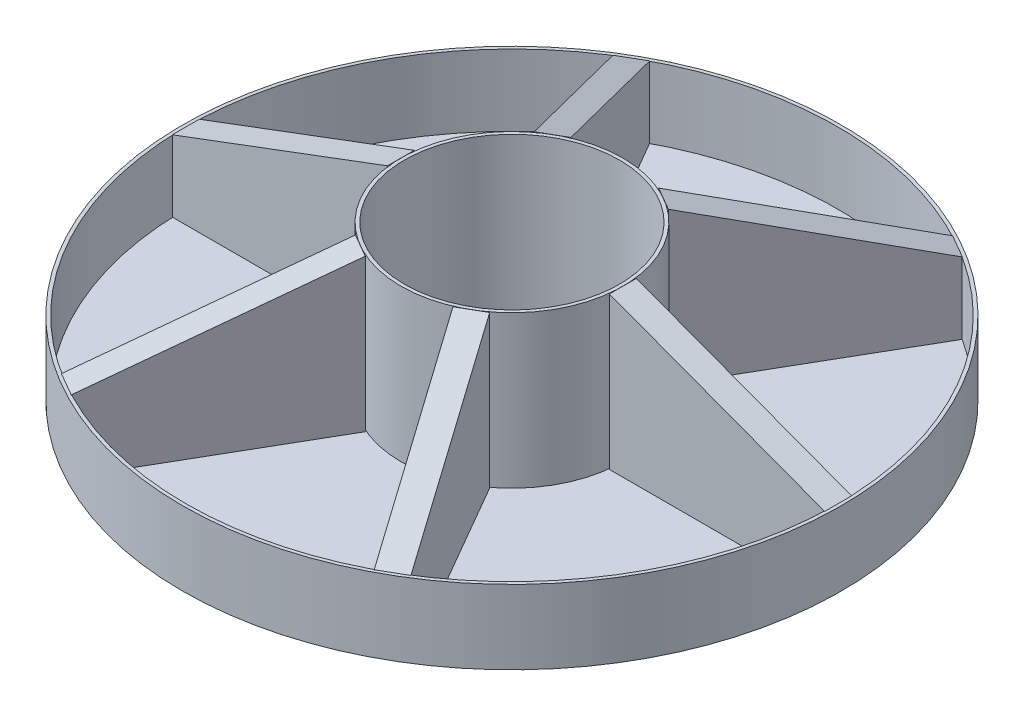
ISO-10303-21;
HEADER;
FILE_DESCRIPTION(('STEP AP214'),'2;1');
FILE_NAME('part.step','',(''),(''),'','','');
FILE_SCHEMA(('AUTOMOTIVE_DESIGN { 1 0 10303 214 1 1 1 1 }'));
ENDSEC;
DATA;
#1=APPLICATION_CONTEXT('core data for automotive mechanical design processes');
#2=APPLICATION_PROTOCOL_DEFINITION('international standard','automotive_design',2000,#1);
#3=PRODUCT_CONTEXT('',#1,'mechanical');
#4=PRODUCT('Part','Part','',(#3));
#5=PRODUCT_RELATED_PRODUCT_CATEGORY('part','',(#4));
#6=PRODUCT_DEFINITION_FORMATION('','',#4);
#7=PRODUCT_DEFINITION_CONTEXT('part definition',#1,'design');
#8=PRODUCT_DEFINITION('design','',#6,#7);
#9=PRODUCT_DEFINITION_SHAPE('','',#8);
#10=(LENGTH_UNIT() NAMED_UNIT(*) SI_UNIT(.MILLI.,.METRE.));
#11=(NAMED_UNIT(*) PLANE_ANGLE_UNIT() SI_UNIT($,.RADIAN.));
#12=(NAMED_UNIT(*) SI_UNIT($,.STERADIAN.) SOLID_ANGLE_UNIT());
#13=UNCERTAINTY_MEASURE_WITH_UNIT(LENGTH_MEASURE(1.E-05),#10,'distance_accuracy_value','');
#14=(GEOMETRIC_REPRESENTATION_CONTEXT(3) GLOBAL_UNCERTAINTY_ASSIGNED_CONTEXT((#13)) GLOBAL_UNIT_ASSIGNED_CONTEXT((#10,
#11,#12)) REPRESENTATION_CONTEXT('',''));
#15=CARTESIAN_POINT('',(0.,0.,0.));
#16=DIRECTION('',(0.,0.,1.));
#17=DIRECTION('',(1.,0.,0.));
#18=AXIS2_PLACEMENT_3D('',#15,#16,#17);
#19=CARTESIAN_POINT('',(-0.433012701892216,0.1,0.250000000000005));
#20=DIRECTION('',(0.,-1.,0.));
#21=DIRECTION('',(0.50000000000001,0.,0.866025403784433));
#22=AXIS2_PLACEMENT_3D('',#19,#20,#21);
#23=PLANE('',#22);
#24=DIRECTION('',(-0.50000000000001,0.,-0.866025403784433));
#25=VECTOR('',#24,1.);
#26=CARTESIAN_POINT('',(0.433012701892216,0.1,-0.250000000000005));
#27=LINE('',#26,#25);
#28=CARTESIAN_POINT('',(-1.62948729810783,0.1,-3.82235479061079));
#29=VERTEX_POINT('',#28);
#30=CARTESIAN_POINT('',(-5.6294872981079,0.0999999999999998,-10.7505580208862));
#31=VERTEX_POINT('',#30);
#32=EDGE_CURVE('E118',#29,#31,#27,.T.);
#33=ORIENTED_EDGE('',*,*,#32,.F.);
#34=DIRECTION('',(0.866025403784433,0.,-0.50000000000001));
#35=VECTOR('',#34,1.);
#36=CARTESIAN_POINT('',(-2.49551270189226,0.1,-3.32235479061078));
#37=LINE('',#36,#35);
#38=CARTESIAN_POINT('',(-2.49551270189226,0.1,-3.32235479061078));
#39=VERTEX_POINT('',#38);
#40=EDGE_CURVE('E13',#39,#29,#37,.T.);
#41=ORIENTED_EDGE('',*,*,#40,.F.);
#42=DIRECTION('',(-0.50000000000001,0.,-0.866025403784433));
#43=VECTOR('',#42,1.);
#44=CARTESIAN_POINT('',(-0.433012701892216,0.1,0.250000000000005));
#45=LINE('',#44,#43);
#46=CARTESIAN_POINT('',(-6.49551270189234,0.0999999999999998,-10.2505580208862));
#47=VERTEX_POINT('',#46);
#48=EDGE_CURVE('E103',#39,#47,#45,.T.);
#49=ORIENTED_EDGE('',*,*,#48,.T.);
#50=DIRECTION('',(0.866025403784433,0.,-0.50000000000001));
#51=VECTOR('',#50,1.);
#52=CARTESIAN_POINT('',(-6.49551270189234,0.0999999999999998,-10.2505580208862));
#53=LINE('',#52,#51);
#54=EDGE_CURVE('E71',#47,#31,#53,.T.);
#55=ORIENTED_EDGE('',*,*,#54,.T.);
#56=EDGE_LOOP('',(#33,#41,#49,#55));
#57=FACE_BOUND('',#56,.T.);
#58=ADVANCED_FACE('F55',(#57),#23,.T.);
#59=CARTESIAN_POINT('',(-2.49551270189226,0.,-3.32235479061078));
#60=DIRECTION('',(-0.50000000000001,0.,-0.866025403784433));
#61=DIRECTION('',(-0.866025403784433,0.,0.50000000000001));
#62=AXIS2_PLACEMENT_3D('',#59,#60,#61);
#63=PLANE('',#62);
#64=DIRECTION('',(0.,1.,0.));
#65=VECTOR('',#64,1.);
#66=CARTESIAN_POINT('',(-1.62948729810783,0.,-3.82235479061079));
#67=LINE('',#66,#65);
#68=CARTESIAN_POINT('',(-1.62948729810783,5.75,-3.82235479061079));
#69=VERTEX_POINT('',#68);
#70=EDGE_CURVE('E109',#29,#69,#67,.T.);
#71=ORIENTED_EDGE('',*,*,#70,.T.);
#72=DIRECTION('',(0.866025403784433,0.,-0.50000000000001));
#73=VECTOR('',#72,1.);
#74=CARTESIAN_POINT('',(-2.49551270189226,5.75,-3.32235479061078));
#75=LINE('',#74,#73);
#76=CARTESIAN_POINT('',(-2.49551270189226,5.75,-3.32235479061078));
#77=VERTEX_POINT('',#76);
#78=EDGE_CURVE('E63',#77,#69,#75,.T.);
#79=ORIENTED_EDGE('',*,*,#78,.F.);
#80=DIRECTION('',(0.,1.,0.));
#81=VECTOR('',#80,1.);
#82=CARTESIAN_POINT('',(-2.49551270189226,0.,-3.32235479061078));
#83=LINE('',#82,#81);
#84=EDGE_CURVE('E97',#39,#77,#83,.T.);
#85=ORIENTED_EDGE('',*,*,#84,.F.);
#86=ORIENTED_EDGE('',*,*,#40,.T.);
#87=EDGE_LOOP('',(#71,#79,#85,#86));
#88=FACE_BOUND('',#87,.T.);
#89=ADVANCED_FACE('F107',(#88),#63,.F.);
#90=CARTESIAN_POINT('',(-1.6324990032621,6.3972602739726,-1.82757121695546));
#91=DIRECTION('',(0.1755617207942,-0.936329177569045,0.304081820279767));
#92=DIRECTION('',(0.468164588784532,0.351123441588392,0.810884854079378));
#93=AXIS2_PLACEMENT_3D('',#90,#91,#92);
#94=PLANE('',#93);
#95=DIRECTION('',(-0.468164588784532,-0.351123441588392,-0.810884854079378));
#96=VECTOR('',#95,1.);
#97=CARTESIAN_POINT('',(-0.766473599477672,6.3972602739726,-2.32757121695547));
#98=LINE('',#97,#96);
#99=CARTESIAN_POINT('',(-5.6294872981079,2.75,-10.7505580208862));
#100=VERTEX_POINT('',#99);
#101=EDGE_CURVE('E121',#69,#100,#98,.T.);
#102=ORIENTED_EDGE('',*,*,#101,.T.);
#103=DIRECTION('',(0.866025403784433,0.,-0.50000000000001));
#104=VECTOR('',#103,1.);
#105=CARTESIAN_POINT('',(-6.49551270189234,2.75,-10.2505580208862));
#106=LINE('',#105,#104);
#107=CARTESIAN_POINT('',(-6.49551270189234,2.75,-10.2505580208862));
#108=VERTEX_POINT('',#107);
#109=EDGE_CURVE('E85',#108,#100,#106,.T.);
#110=ORIENTED_EDGE('',*,*,#109,.F.);
#111=DIRECTION('',(-0.468164588784532,-0.351123441588392,-0.810884854079378));
#112=VECTOR('',#111,1.);
#113=CARTESIAN_POINT('',(-1.6324990032621,6.3972602739726,-1.82757121695546));
#114=LINE('',#113,#112);
#115=EDGE_CURVE('E102',#77,#108,#114,.T.);
#116=ORIENTED_EDGE('',*,*,#115,.F.);
#117=ORIENTED_EDGE('',*,*,#78,.T.);
#118=EDGE_LOOP('',(#102,#110,#116,#117));
#119=FACE_BOUND('',#118,.T.);
#120=ADVANCED_FACE('F112',(#119),#94,.F.);
#121=CARTESIAN_POINT('',(-6.49551270189234,0.,-10.2505580208862));
#122=DIRECTION('',(-0.50000000000001,0.,-0.866025403784433));
#123=DIRECTION('',(-0.866025403784433,0.,0.50000000000001));
#124=AXIS2_PLACEMENT_3D('',#121,#122,#123);
#125=PLANE('',#124);
#126=DIRECTION('',(0.,1.,0.));
#127=VECTOR('',#126,1.);
#128=CARTESIAN_POINT('',(-5.6294872981079,0.,-10.7505580208862));
#129=LINE('',#128,#127);
#130=EDGE_CURVE('E123',#31,#100,#129,.T.);
#131=ORIENTED_EDGE('',*,*,#130,.F.);
#132=ORIENTED_EDGE('',*,*,#54,.F.);
#133=DIRECTION('',(0.,1.,0.));
#134=VECTOR('',#133,1.);
#135=CARTESIAN_POINT('',(-6.49551270189234,0.,-10.2505580208862));
#136=LINE('',#135,#134);
#137=EDGE_CURVE('E113',#47,#108,#136,.T.);
#138=ORIENTED_EDGE('',*,*,#137,.T.);
#139=ORIENTED_EDGE('',*,*,#109,.T.);
#140=EDGE_LOOP('',(#131,#132,#138,#139));
#141=FACE_BOUND('',#140,.T.);
#142=ADVANCED_FACE('F128',(#141),#125,.T.);
#143=CARTESIAN_POINT('',(-0.433012701892216,0.,0.250000000000005));
#144=DIRECTION('',(-0.866025403784433,0.,0.50000000000001));
#145=DIRECTION('',(0.50000000000001,0.,0.866025403784433));
#146=AXIS2_PLACEMENT_3D('',#143,#144,#145);
#147=PLANE('',#146);
#148=ORIENTED_EDGE('',*,*,#48,.F.);
#149=ORIENTED_EDGE('',*,*,#84,.T.);
#150=ORIENTED_EDGE('',*,*,#115,.T.);
#151=ORIENTED_EDGE('',*,*,#137,.F.);
#152=EDGE_LOOP('',(#148,#149,#150,#151));
#153=FACE_BOUND('',#152,.T.);
#154=ADVANCED_FACE('F99',(#153),#147,.T.);
#155=CARTESIAN_POINT('',(0.433012701892216,0.,-0.250000000000005));
#156=DIRECTION('',(-0.866025403784433,0.,0.50000000000001));
#157=DIRECTION('',(0.50000000000001,0.,0.866025403784433));
#158=AXIS2_PLACEMENT_3D('',#155,#156,#157);
#159=PLANE('',#158);
#160=ORIENTED_EDGE('',*,*,#32,.T.);
#161=ORIENTED_EDGE('',*,*,#130,.T.);
#162=ORIENTED_EDGE('',*,*,#101,.F.);
#163=ORIENTED_EDGE('',*,*,#70,.F.);
#164=EDGE_LOOP('',(#160,#161,#162,#163));
#165=FACE_BOUND('',#164,.T.);
#166=ADVANCED_FACE('F135',(#165),#159,.F.);
#167=CLOSED_SHELL('',(#58,#89,#120,#142,#154,#166));
#168=MANIFOLD_SOLID_BREP('B2',#167);
#169=CARTESIAN_POINT('',(-0.433012701892222,0.1,-0.249999999999996));
#170=DIRECTION('',(0.,-1.,0.));
#171=DIRECTION('',(-0.499999999999992,0.,0.866025403784443));
#172=AXIS2_PLACEMENT_3D('',#169,#170,#171);
#173=PLANE('',#172);
#174=DIRECTION('',(0.499999999999992,0.,-0.866025403784443));
#175=VECTOR('',#174,1.);
#176=CARTESIAN_POINT('',(0.433012701892222,0.1,0.249999999999996));
#177=LINE('',#176,#175);
#178=CARTESIAN_POINT('',(2.49551270189219,0.1,-3.32235479061083));
#179=VERTEX_POINT('',#178);
#180=CARTESIAN_POINT('',(6.49551270189212,0.0999999999999998,-10.2505580208864));
#181=VERTEX_POINT('',#180);
#182=EDGE_CURVE('E254',#179,#181,#177,.T.);
#183=ORIENTED_EDGE('',*,*,#182,.F.);
#184=DIRECTION('',(0.866025403784443,0.,0.499999999999992));
#185=VECTOR('',#184,1.);
#186=CARTESIAN_POINT('',(1.62948729810775,0.1,-3.82235479061082));
#187=LINE('',#186,#185);
#188=CARTESIAN_POINT('',(1.62948729810775,0.1,-3.82235479061082));
#189=VERTEX_POINT('',#188);
#190=EDGE_CURVE('E53',#189,#179,#187,.T.);
#191=ORIENTED_EDGE('',*,*,#190,.F.);
#192=DIRECTION('',(0.499999999999992,0.,-0.866025403784443));
#193=VECTOR('',#192,1.);
#194=CARTESIAN_POINT('',(-0.433012701892222,0.1,-0.249999999999996));
#195=LINE('',#194,#193);
#196=CARTESIAN_POINT('',(5.62948729810768,0.0999999999999998,-10.7505580208864));
#197=VERTEX_POINT('',#196);
#198=EDGE_CURVE('E239',#189,#197,#195,.T.);
#199=ORIENTED_EDGE('',*,*,#198,.T.);
#200=DIRECTION('',(0.866025403784443,0.,0.499999999999992));
#201=VECTOR('',#200,1.);
#202=CARTESIAN_POINT('',(5.62948729810768,0.0999999999999998,-10.7505580208864));
#203=LINE('',#202,#201);
#204=EDGE_CURVE('E207',#197,#181,#203,.T.);
#205=ORIENTED_EDGE('',*,*,#204,.T.);
#206=EDGE_LOOP('',(#183,#191,#199,#205));
#207=FACE_BOUND('',#206,.T.);
#208=ADVANCED_FACE('F191',(#207),#173,.T.);
#209=CARTESIAN_POINT('',(1.62948729810775,0.,-3.82235479061082));
#210=DIRECTION('',(0.499999999999992,0.,-0.866025403784443));
#211=DIRECTION('',(-0.866025403784443,0.,-0.499999999999992));
#212=AXIS2_PLACEMENT_3D('',#209,#210,#211);
#213=PLANE('',#212);
#214=DIRECTION('',(0.,1.,0.));
#215=VECTOR('',#214,1.);
#216=CARTESIAN_POINT('',(2.49551270189219,0.,-3.32235479061083));
#217=LINE('',#216,#215);
#218=CARTESIAN_POINT('',(2.49551270189219,5.75,-3.32235479061083));
#219=VERTEX_POINT('',#218);
#220=EDGE_CURVE('E245',#179,#219,#217,.T.);
#221=ORIENTED_EDGE('',*,*,#220,.T.);
#222=DIRECTION('',(0.866025403784443,0.,0.499999999999992));
#223=VECTOR('',#222,1.);
#224=CARTESIAN_POINT('',(1.62948729810775,5.75,-3.82235479061082));
#225=LINE('',#224,#223);
#226=CARTESIAN_POINT('',(1.62948729810775,5.75,-3.82235479061082));
#227=VERTEX_POINT('',#226);
#228=EDGE_CURVE('E199',#227,#219,#225,.T.);
#229=ORIENTED_EDGE('',*,*,#228,.F.);
#230=DIRECTION('',(0.,1.,0.));
#231=VECTOR('',#230,1.);
#232=CARTESIAN_POINT('',(1.62948729810775,0.,-3.82235479061082));
#233=LINE('',#232,#231);
#234=EDGE_CURVE('E233',#189,#227,#233,.T.);
#235=ORIENTED_EDGE('',*,*,#234,.F.);
#236=ORIENTED_EDGE('',*,*,#190,.T.);
#237=EDGE_LOOP('',(#221,#229,#235,#236));
#238=FACE_BOUND('',#237,.T.);
#239=ADVANCED_FACE('F243',(#238),#213,.F.);
#240=CARTESIAN_POINT('',(0.766473599477623,6.3972602739726,-2.32757121695549));
#241=DIRECTION('',(-0.175561720794193,-0.936329177569045,0.30408182027977));
#242=DIRECTION('',(-0.468164588784515,0.351123441588392,0.810884854079387));
#243=AXIS2_PLACEMENT_3D('',#240,#241,#242);
#244=PLANE('',#243);
#245=DIRECTION('',(0.468164588784515,-0.351123441588392,-0.810884854079387));
#246=VECTOR('',#245,1.);
#247=CARTESIAN_POINT('',(1.63249900326207,6.3972602739726,-1.82757121695549));
#248=LINE('',#247,#246);
#249=CARTESIAN_POINT('',(6.49551270189212,2.75,-10.2505580208864));
#250=VERTEX_POINT('',#249);
#251=EDGE_CURVE('E257',#219,#250,#248,.T.);
#252=ORIENTED_EDGE('',*,*,#251,.T.);
#253=DIRECTION('',(0.866025403784443,0.,0.499999999999992));
#254=VECTOR('',#253,1.);
#255=CARTESIAN_POINT('',(5.62948729810768,2.75,-10.7505580208864));
#256=LINE('',#255,#254);
#257=CARTESIAN_POINT('',(5.62948729810768,2.75,-10.7505580208864));
#258=VERTEX_POINT('',#257);
#259=EDGE_CURVE('E221',#258,#250,#256,.T.);
#260=ORIENTED_EDGE('',*,*,#259,.F.);
#261=DIRECTION('',(0.468164588784515,-0.351123441588392,-0.810884854079387));
#262=VECTOR('',#261,1.);
#263=CARTESIAN_POINT('',(0.766473599477623,6.3972602739726,-2.32757121695549));
#264=LINE('',#263,#262);
#265=EDGE_CURVE('E238',#227,#258,#264,.T.);
#266=ORIENTED_EDGE('',*,*,#265,.F.);
#267=ORIENTED_EDGE('',*,*,#228,.T.);
#268=EDGE_LOOP('',(#252,#260,#266,#267));
#269=FACE_BOUND('',#268,.T.);
#270=ADVANCED_FACE('F248',(#269),#244,.F.);
#271=CARTESIAN_POINT('',(5.62948729810768,0.,-10.7505580208864));
#272=DIRECTION('',(0.499999999999992,0.,-0.866025403784443));
#273=DIRECTION('',(-0.866025403784443,0.,-0.499999999999992));
#274=AXIS2_PLACEMENT_3D('',#271,#272,#273);
#275=PLANE('',#274);
#276=DIRECTION('',(0.,1.,0.));
#277=VECTOR('',#276,1.);
#278=CARTESIAN_POINT('',(6.49551270189212,0.,-10.2505580208864));
#279=LINE('',#278,#277);
#280=EDGE_CURVE('E259',#181,#250,#279,.T.);
#281=ORIENTED_EDGE('',*,*,#280,.F.);
#282=ORIENTED_EDGE('',*,*,#204,.F.);
#283=DIRECTION('',(0.,1.,0.));
#284=VECTOR('',#283,1.);
#285=CARTESIAN_POINT('',(5.62948729810768,0.,-10.7505580208864));
#286=LINE('',#285,#284);
#287=EDGE_CURVE('E249',#197,#258,#286,.T.);
#288=ORIENTED_EDGE('',*,*,#287,.T.);
#289=ORIENTED_EDGE('',*,*,#259,.T.);
#290=EDGE_LOOP('',(#281,#282,#288,#289));
#291=FACE_BOUND('',#290,.T.);
#292=ADVANCED_FACE('F264',(#291),#275,.T.);
#293=CARTESIAN_POINT('',(-0.433012701892222,0.,-0.249999999999996));
#294=DIRECTION('',(-0.866025403784443,0.,-0.499999999999992));
#295=DIRECTION('',(-0.499999999999992,0.,0.866025403784443));
#296=AXIS2_PLACEMENT_3D('',#293,#294,#295);
#297=PLANE('',#296);
#298=ORIENTED_EDGE('',*,*,#198,.F.);
#299=ORIENTED_EDGE('',*,*,#234,.T.);
#300=ORIENTED_EDGE('',*,*,#265,.T.);
#301=ORIENTED_EDGE('',*,*,#287,.F.);
#302=EDGE_LOOP('',(#298,#299,#300,#301));
#303=FACE_BOUND('',#302,.T.);
#304=ADVANCED_FACE('F235',(#303),#297,.T.);
#305=CARTESIAN_POINT('',(0.433012701892222,0.,0.249999999999996));
#306=DIRECTION('',(-0.866025403784443,0.,-0.499999999999992));
#307=DIRECTION('',(-0.499999999999992,0.,0.866025403784443));
#308=AXIS2_PLACEMENT_3D('',#305,#306,#307);
#309=PLANE('',#308);
#310=ORIENTED_EDGE('',*,*,#182,.T.);
#311=ORIENTED_EDGE('',*,*,#280,.T.);
#312=ORIENTED_EDGE('',*,*,#251,.F.);
#313=ORIENTED_EDGE('',*,*,#220,.F.);
#314=EDGE_LOOP('',(#310,#311,#312,#313));
#315=FACE_BOUND('',#314,.T.);
#316=ADVANCED_FACE('F271',(#315),#309,.F.);
#317=CLOSED_SHELL('',(#208,#239,#270,#292,#304,#316));
#318=MANIFOLD_SOLID_BREP('B7',#317);
#319=CARTESIAN_POINT('',(0.,0.1,-0.5));
#320=DIRECTION('',(0.,-1.,0.));
#321=DIRECTION('',(-1.,0.,0.));
#322=AXIS2_PLACEMENT_3D('',#319,#320,#321);
#323=PLANE('',#322);
#324=DIRECTION('',(1.,0.,0.));
#325=VECTOR('',#324,1.);
#326=CARTESIAN_POINT('',(0.,0.1,0.5));
#327=LINE('',#326,#325);
#328=CARTESIAN_POINT('',(4.125,0.1,0.5));
#329=VERTEX_POINT('',#328);
#330=CARTESIAN_POINT('',(12.125,0.0999999999999998,0.5));
#331=VERTEX_POINT('',#330);
#332=EDGE_CURVE('E390',#329,#331,#327,.T.);
#333=ORIENTED_EDGE('',*,*,#332,.F.);
#334=DIRECTION('',(0.,0.,1.));
#335=VECTOR('',#334,1.);
#336=CARTESIAN_POINT('',(4.125,0.1,-0.5));
#337=LINE('',#336,#335);
#338=CARTESIAN_POINT('',(4.125,0.1,-0.5));
#339=VERTEX_POINT('',#338);
#340=EDGE_CURVE('E189',#339,#329,#337,.T.);
#341=ORIENTED_EDGE('',*,*,#340,.F.);
#342=DIRECTION('',(1.,0.,0.));
#343=VECTOR('',#342,1.);
#344=CARTESIAN_POINT('',(0.,0.1,-0.5));
#345=LINE('',#344,#343);
#346=CARTESIAN_POINT('',(12.125,0.0999999999999998,-0.5));
#347=VERTEX_POINT('',#346);
#348=EDGE_CURVE('E375',#339,#347,#345,.T.);
#349=ORIENTED_EDGE('',*,*,#348,.T.);
#350=DIRECTION('',(0.,0.,1.));
#351=VECTOR('',#350,1.);
#352=CARTESIAN_POINT('',(12.125,0.0999999999999998,-0.5));
#353=LINE('',#352,#351);
#354=EDGE_CURVE('E343',#347,#331,#353,.T.);
#355=ORIENTED_EDGE('',*,*,#354,.T.);
#356=EDGE_LOOP('',(#333,#341,#349,#355));
#357=FACE_BOUND('',#356,.T.);
#358=ADVANCED_FACE('F327',(#357),#323,.T.);
#359=CARTESIAN_POINT('',(4.125,0.,-0.5));
#360=DIRECTION('',(1.,0.,0.));
#361=DIRECTION('',(0.,0.,-1.));
#362=AXIS2_PLACEMENT_3D('',#359,#360,#361);
#363=PLANE('',#362);
#364=DIRECTION('',(0.,1.,0.));
#365=VECTOR('',#364,1.);
#366=CARTESIAN_POINT('',(4.125,0.,0.5));
#367=LINE('',#366,#365);
#368=CARTESIAN_POINT('',(4.125,5.75,0.5));
#369=VERTEX_POINT('',#368);
#370=EDGE_CURVE('E381',#329,#369,#367,.T.);
#371=ORIENTED_EDGE('',*,*,#370,.T.);
#372=DIRECTION('',(0.,0.,1.));
#373=VECTOR('',#372,1.);
#374=CARTESIAN_POINT('',(4.125,5.75,-0.5));
#375=LINE('',#374,#373);
#376=CARTESIAN_POINT('',(4.125,5.75,-0.5));
#377=VERTEX_POINT('',#376);
#378=EDGE_CURVE('E335',#377,#369,#375,.T.);
#379=ORIENTED_EDGE('',*,*,#378,.F.);
#380=DIRECTION('',(0.,1.,0.));
#381=VECTOR('',#380,1.);
#382=CARTESIAN_POINT('',(4.125,0.,-0.5));
#383=LINE('',#382,#381);
#384=EDGE_CURVE('E369',#339,#377,#383,.T.);
#385=ORIENTED_EDGE('',*,*,#384,.F.);
#386=ORIENTED_EDGE('',*,*,#340,.T.);
#387=EDGE_LOOP('',(#371,#379,#385,#386));
#388=FACE_BOUND('',#387,.T.);
#389=ADVANCED_FACE('F379',(#388),#363,.F.);
#390=CARTESIAN_POINT('',(2.39897260273973,6.3972602739726,-0.5));
#391=DIRECTION('',(-0.351123441588392,-0.936329177569045,0.));
#392=DIRECTION('',(-0.936329177569045,0.351123441588392,0.));
#393=AXIS2_PLACEMENT_3D('',#390,#391,#392);
#394=PLANE('',#393);
#395=DIRECTION('',(0.936329177569044,-0.351123441588392,0.));
#396=VECTOR('',#395,1.);
#397=CARTESIAN_POINT('',(2.39897260273973,6.3972602739726,0.5));
#398=LINE('',#397,#396);
#399=CARTESIAN_POINT('',(12.125,2.75,0.5));
#400=VERTEX_POINT('',#399);
#401=EDGE_CURVE('E393',#369,#400,#398,.T.);
#402=ORIENTED_EDGE('',*,*,#401,.T.);
#403=DIRECTION('',(0.,0.,1.));
#404=VECTOR('',#403,1.);
#405=CARTESIAN_POINT('',(12.125,2.75,-0.5));
#406=LINE('',#405,#404);
#407=CARTESIAN_POINT('',(12.125,2.75,-0.5));
#408=VERTEX_POINT('',#407);
#409=EDGE_CURVE('E357',#408,#400,#406,.T.);
#410=ORIENTED_EDGE('',*,*,#409,.F.);
#411=DIRECTION('',(0.936329177569044,-0.351123441588392,0.));
#412=VECTOR('',#411,1.);
#413=CARTESIAN_POINT('',(2.39897260273973,6.3972602739726,-0.5));
#414=LINE('',#413,#412);
#415=EDGE_CURVE('E374',#377,#408,#414,.T.);
#416=ORIENTED_EDGE('',*,*,#415,.F.);
#417=ORIENTED_EDGE('',*,*,#378,.T.);
#418=EDGE_LOOP('',(#402,#410,#416,#417));
#419=FACE_BOUND('',#418,.T.);
#420=ADVANCED_FACE('F384',(#419),#394,.F.);
#421=CARTESIAN_POINT('',(12.125,0.,-0.5));
#422=DIRECTION('',(1.,0.,0.));
#423=DIRECTION('',(0.,0.,-1.));
#424=AXIS2_PLACEMENT_3D('',#421,#422,#423);
#425=PLANE('',#424);
#426=DIRECTION('',(0.,1.,0.));
#427=VECTOR('',#426,1.);
#428=CARTESIAN_POINT('',(12.125,0.,0.5));
#429=LINE('',#428,#427);
#430=EDGE_CURVE('E395',#331,#400,#429,.T.);
#431=ORIENTED_EDGE('',*,*,#430,.F.);
#432=ORIENTED_EDGE('',*,*,#354,.F.);
#433=DIRECTION('',(0.,1.,0.));
#434=VECTOR('',#433,1.);
#435=CARTESIAN_POINT('',(12.125,0.,-0.5));
#436=LINE('',#435,#434);
#437=EDGE_CURVE('E385',#347,#408,#436,.T.);
#438=ORIENTED_EDGE('',*,*,#437,.T.);
#439=ORIENTED_EDGE('',*,*,#409,.T.);
#440=EDGE_LOOP('',(#431,#432,#438,#439));
#441=FACE_BOUND('',#440,.T.);
#442=ADVANCED_FACE('F400',(#441),#425,.T.);
#443=CARTESIAN_POINT('',(0.,0.,-0.5));
#444=DIRECTION('',(0.,0.,-1.));
#445=DIRECTION('',(-1.,0.,0.));
#446=AXIS2_PLACEMENT_3D('',#443,#444,#445);
#447=PLANE('',#446);
#448=ORIENTED_EDGE('',*,*,#348,.F.);
#449=ORIENTED_EDGE('',*,*,#384,.T.);
#450=ORIENTED_EDGE('',*,*,#415,.T.);
#451=ORIENTED_EDGE('',*,*,#437,.F.);
#452=EDGE_LOOP('',(#448,#449,#450,#451));
#453=FACE_BOUND('',#452,.T.);
#454=ADVANCED_FACE('F371',(#453),#447,.T.);
#455=CARTESIAN_POINT('',(0.,0.,0.5));
#456=DIRECTION('',(0.,0.,-1.));
#457=DIRECTION('',(-1.,0.,0.));
#458=AXIS2_PLACEMENT_3D('',#455,#456,#457);
#459=PLANE('',#458);
#460=ORIENTED_EDGE('',*,*,#332,.T.);
#461=ORIENTED_EDGE('',*,*,#430,.T.);
#462=ORIENTED_EDGE('',*,*,#401,.F.);
#463=ORIENTED_EDGE('',*,*,#370,.F.);
#464=EDGE_LOOP('',(#460,#461,#462,#463));
#465=FACE_BOUND('',#464,.T.);
#466=ADVANCED_FACE('F407',(#465),#459,.F.);
#467=CLOSED_SHELL('',(#358,#389,#420,#442,#454,#466));
#468=MANIFOLD_SOLID_BREP('B47',#467);
#469=CARTESIAN_POINT('',(0.433012701892218,0.1,-0.250000000000002));
#470=DIRECTION('',(0.,-1.,0.));
#471=DIRECTION('',(-0.500000000000004,0.,-0.866025403784436));
#472=AXIS2_PLACEMENT_3D('',#469,#470,#471);
#473=PLANE('',#472);
#474=DIRECTION('',(0.500000000000004,0.,0.866025403784436));
#475=VECTOR('',#474,1.);
#476=CARTESIAN_POINT('',(-0.433012701892218,0.1,0.250000000000002));
#477=LINE('',#476,#475);
#478=CARTESIAN_POINT('',(1.6294872981078,0.1,3.8223547906108));
#479=VERTEX_POINT('',#478);
#480=CARTESIAN_POINT('',(5.62948729810783,0.0999999999999998,10.7505580208863));
#481=VERTEX_POINT('',#480);
#482=EDGE_CURVE('E526',#479,#481,#477,.T.);
#483=ORIENTED_EDGE('',*,*,#482,.F.);
#484=DIRECTION('',(-0.866025403784436,0.,0.500000000000004));
#485=VECTOR('',#484,1.);
#486=CARTESIAN_POINT('',(2.49551270189224,0.1,3.3223547906108));
#487=LINE('',#486,#485);
#488=CARTESIAN_POINT('',(2.49551270189224,0.1,3.3223547906108));
#489=VERTEX_POINT('',#488);
#490=EDGE_CURVE('E325',#489,#479,#487,.T.);
#491=ORIENTED_EDGE('',*,*,#490,.F.);
#492=DIRECTION('',(0.500000000000004,0.,0.866025403784436));
#493=VECTOR('',#492,1.);
#494=CARTESIAN_POINT('',(0.433012701892218,0.1,-0.250000000000002));
#495=LINE('',#494,#493);
#496=CARTESIAN_POINT('',(6.49551270189226,0.0999999999999998,10.2505580208863));
#497=VERTEX_POINT('',#496);
#498=EDGE_CURVE('E511',#489,#497,#495,.T.);
#499=ORIENTED_EDGE('',*,*,#498,.T.);
#500=DIRECTION('',(-0.866025403784436,0.,0.500000000000004));
#501=VECTOR('',#500,1.);
#502=CARTESIAN_POINT('',(6.49551270189226,0.0999999999999998,10.2505580208863));
#503=LINE('',#502,#501);
#504=EDGE_CURVE('E479',#497,#481,#503,.T.);
#505=ORIENTED_EDGE('',*,*,#504,.T.);
#506=EDGE_LOOP('',(#483,#491,#499,#505));
#507=FACE_BOUND('',#506,.T.);
#508=ADVANCED_FACE('F463',(#507),#473,.T.);
#509=CARTESIAN_POINT('',(2.49551270189224,0.,3.3223547906108));
#510=DIRECTION('',(0.500000000000004,0.,0.866025403784436));
#511=DIRECTION('',(0.866025403784436,0.,-0.500000000000004));
#512=AXIS2_PLACEMENT_3D('',#509,#510,#511);
#513=PLANE('',#512);
#514=DIRECTION('',(0.,1.,0.));
#515=VECTOR('',#514,1.);
#516=CARTESIAN_POINT('',(1.6294872981078,0.,3.8223547906108));
#517=LINE('',#516,#515);
#518=CARTESIAN_POINT('',(1.6294872981078,5.75,3.8223547906108));
#519=VERTEX_POINT('',#518);
#520=EDGE_CURVE('E517',#479,#519,#517,.T.);
#521=ORIENTED_EDGE('',*,*,#520,.T.);
#522=DIRECTION('',(-0.866025403784436,0.,0.500000000000004));
#523=VECTOR('',#522,1.);
#524=CARTESIAN_POINT('',(2.49551270189224,5.75,3.3223547906108));
#525=LINE('',#524,#523);
#526=CARTESIAN_POINT('',(2.49551270189224,5.75,3.3223547906108));
#527=VERTEX_POINT('',#526);
#528=EDGE_CURVE('E471',#527,#519,#525,.T.);
#529=ORIENTED_EDGE('',*,*,#528,.F.);
#530=DIRECTION('',(0.,1.,0.));
#531=VECTOR('',#530,1.);
#532=CARTESIAN_POINT('',(2.49551270189224,0.,3.3223547906108));
#533=LINE('',#532,#531);
#534=EDGE_CURVE('E505',#489,#527,#533,.T.);
#535=ORIENTED_EDGE('',*,*,#534,.F.);
#536=ORIENTED_EDGE('',*,*,#490,.T.);
#537=EDGE_LOOP('',(#521,#529,#535,#536));
#538=FACE_BOUND('',#537,.T.);
#539=ADVANCED_FACE('F515',(#538),#513,.F.);
#540=CARTESIAN_POINT('',(1.63249900326209,6.3972602739726,1.82757121695547));
#541=DIRECTION('',(-0.175561720794197,-0.936329177569045,-0.304081820279768));
#542=DIRECTION('',(-0.468164588784526,0.351123441588392,-0.810884854079381));
#543=AXIS2_PLACEMENT_3D('',#540,#541,#542);
#544=PLANE('',#543);
#545=DIRECTION('',(0.468164588784526,-0.351123441588392,0.810884854079381));
#546=VECTOR('',#545,1.);
#547=CARTESIAN_POINT('',(0.766473599477655,6.3972602739726,2.32757121695548));
#548=LINE('',#547,#546);
#549=CARTESIAN_POINT('',(5.62948729810783,2.75,10.7505580208863));
#550=VERTEX_POINT('',#549);
#551=EDGE_CURVE('E529',#519,#550,#548,.T.);
#552=ORIENTED_EDGE('',*,*,#551,.T.);
#553=DIRECTION('',(-0.866025403784436,0.,0.500000000000004));
#554=VECTOR('',#553,1.);
#555=CARTESIAN_POINT('',(6.49551270189226,2.75,10.2505580208863));
#556=LINE('',#555,#554);
#557=CARTESIAN_POINT('',(6.49551270189226,2.75,10.2505580208863));
#558=VERTEX_POINT('',#557);
#559=EDGE_CURVE('E493',#558,#550,#556,.T.);
#560=ORIENTED_EDGE('',*,*,#559,.F.);
#561=DIRECTION('',(0.468164588784526,-0.351123441588392,0.810884854079381));
#562=VECTOR('',#561,1.);
#563=CARTESIAN_POINT('',(1.63249900326209,6.3972602739726,1.82757121695547));
#564=LINE('',#563,#562);
#565=EDGE_CURVE('E510',#527,#558,#564,.T.);
#566=ORIENTED_EDGE('',*,*,#565,.F.);
#567=ORIENTED_EDGE('',*,*,#528,.T.);
#568=EDGE_LOOP('',(#552,#560,#566,#567));
#569=FACE_BOUND('',#568,.T.);
#570=ADVANCED_FACE('F520',(#569),#544,.F.);
#571=CARTESIAN_POINT('',(6.49551270189226,0.,10.2505580208863));
#572=DIRECTION('',(0.500000000000004,0.,0.866025403784436));
#573=DIRECTION('',(0.866025403784436,0.,-0.500000000000004));
#574=AXIS2_PLACEMENT_3D('',#571,#572,#573);
#575=PLANE('',#574);
#576=DIRECTION('',(0.,1.,0.));
#577=VECTOR('',#576,1.);
#578=CARTESIAN_POINT('',(5.62948729810783,0.,10.7505580208863));
#579=LINE('',#578,#577);
#580=EDGE_CURVE('E531',#481,#550,#579,.T.);
#581=ORIENTED_EDGE('',*,*,#580,.F.);
#582=ORIENTED_EDGE('',*,*,#504,.F.);
#583=DIRECTION('',(0.,1.,0.));
#584=VECTOR('',#583,1.);
#585=CARTESIAN_POINT('',(6.49551270189226,0.,10.2505580208863));
#586=LINE('',#585,#584);
#587=EDGE_CURVE('E521',#497,#558,#586,.T.);
#588=ORIENTED_EDGE('',*,*,#587,.T.);
#589=ORIENTED_EDGE('',*,*,#559,.T.);
#590=EDGE_LOOP('',(#581,#582,#588,#589));
#591=FACE_BOUND('',#590,.T.);
#592=ADVANCED_FACE('F536',(#591),#575,.T.);
#593=CARTESIAN_POINT('',(0.433012701892218,0.,-0.250000000000002));
#594=DIRECTION('',(0.866025403784436,0.,-0.500000000000004));
#595=DIRECTION('',(-0.500000000000004,0.,-0.866025403784436));
#596=AXIS2_PLACEMENT_3D('',#593,#594,#595);
#597=PLANE('',#596);
#598=ORIENTED_EDGE('',*,*,#498,.F.);
#599=ORIENTED_EDGE('',*,*,#534,.T.);
#600=ORIENTED_EDGE('',*,*,#565,.T.);
#601=ORIENTED_EDGE('',*,*,#587,.F.);
#602=EDGE_LOOP('',(#598,#599,#600,#601));
#603=FACE_BOUND('',#602,.T.);
#604=ADVANCED_FACE('F507',(#603),#597,.T.);
#605=CARTESIAN_POINT('',(-0.433012701892218,0.,0.250000000000002));
#606=DIRECTION('',(0.866025403784436,0.,-0.500000000000004));
#607=DIRECTION('',(-0.500000000000004,0.,-0.866025403784436));
#608=AXIS2_PLACEMENT_3D('',#605,#606,#607);
#609=PLANE('',#608);
#610=ORIENTED_EDGE('',*,*,#482,.T.);
#611=ORIENTED_EDGE('',*,*,#580,.T.);
#612=ORIENTED_EDGE('',*,*,#551,.F.);
#613=ORIENTED_EDGE('',*,*,#520,.F.);
#614=EDGE_LOOP('',(#610,#611,#612,#613));
#615=FACE_BOUND('',#614,.T.);
#616=ADVANCED_FACE('F543',(#615),#609,.F.);
#617=CLOSED_SHELL('',(#508,#539,#570,#592,#604,#616));
#618=MANIFOLD_SOLID_BREP('B183',#617);
#619=CARTESIAN_POINT('',(0.43301270189222,0.1,0.249999999999999));
#620=DIRECTION('',(0.,-1.,0.));
#621=DIRECTION('',(0.499999999999998,0.,-0.86602540378444));
#622=AXIS2_PLACEMENT_3D('',#619,#620,#621);
#623=PLANE('',#622);
#624=DIRECTION('',(-0.499999999999998,0.,0.86602540378444));
#625=VECTOR('',#624,1.);
#626=CARTESIAN_POINT('',(-0.43301270189222,0.1,-0.249999999999999));
#627=LINE('',#626,#625);
#628=CARTESIAN_POINT('',(-2.49551270189221,0.1,3.32235479061082));
#629=VERTEX_POINT('',#628);
#630=CARTESIAN_POINT('',(-6.49551270189219,0.0999999999999998,10.2505580208863));
#631=VERTEX_POINT('',#630);
#632=EDGE_CURVE('E662',#629,#631,#627,.T.);
#633=ORIENTED_EDGE('',*,*,#632,.F.);
#634=DIRECTION('',(-0.86602540378444,0.,-0.499999999999998));
#635=VECTOR('',#634,1.);
#636=CARTESIAN_POINT('',(-1.62948729810777,0.1,3.82235479061081));
#637=LINE('',#636,#635);
#638=CARTESIAN_POINT('',(-1.62948729810777,0.1,3.82235479061081));
#639=VERTEX_POINT('',#638);
#640=EDGE_CURVE('E461',#639,#629,#637,.T.);
#641=ORIENTED_EDGE('',*,*,#640,.F.);
#642=DIRECTION('',(-0.499999999999998,0.,0.86602540378444));
#643=VECTOR('',#642,1.);
#644=CARTESIAN_POINT('',(0.43301270189222,0.1,0.249999999999999));
#645=LINE('',#644,#643);
#646=CARTESIAN_POINT('',(-5.62948729810775,0.0999999999999998,10.7505580208863));
#647=VERTEX_POINT('',#646);
#648=EDGE_CURVE('E647',#639,#647,#645,.T.);
#649=ORIENTED_EDGE('',*,*,#648,.T.);
#650=DIRECTION('',(-0.86602540378444,0.,-0.499999999999998));
#651=VECTOR('',#650,1.);
#652=CARTESIAN_POINT('',(-5.62948729810775,0.0999999999999998,10.7505580208863));
#653=LINE('',#652,#651);
#654=EDGE_CURVE('E615',#647,#631,#653,.T.);
#655=ORIENTED_EDGE('',*,*,#654,.T.);
#656=EDGE_LOOP('',(#633,#641,#649,#655));
#657=FACE_BOUND('',#656,.T.);
#658=ADVANCED_FACE('F599',(#657),#623,.T.);
#659=CARTESIAN_POINT('',(-1.62948729810777,0.,3.82235479061081));
#660=DIRECTION('',(-0.499999999999998,0.,0.86602540378444));
#661=DIRECTION('',(0.86602540378444,0.,0.499999999999998));
#662=AXIS2_PLACEMENT_3D('',#659,#660,#661);
#663=PLANE('',#662);
#664=DIRECTION('',(0.,1.,0.));
#665=VECTOR('',#664,1.);
#666=CARTESIAN_POINT('',(-2.49551270189221,0.,3.32235479061082));
#667=LINE('',#666,#665);
#668=CARTESIAN_POINT('',(-2.49551270189221,5.75,3.32235479061082));
#669=VERTEX_POINT('',#668);
#670=EDGE_CURVE('E653',#629,#669,#667,.T.);
#671=ORIENTED_EDGE('',*,*,#670,.T.);
#672=DIRECTION('',(-0.86602540378444,0.,-0.499999999999998));
#673=VECTOR('',#672,1.);
#674=CARTESIAN_POINT('',(-1.62948729810777,5.75,3.82235479061081));
#675=LINE('',#674,#673);
#676=CARTESIAN_POINT('',(-1.62948729810777,5.75,3.82235479061081));
#677=VERTEX_POINT('',#676);
#678=EDGE_CURVE('E607',#677,#669,#675,.T.);
#679=ORIENTED_EDGE('',*,*,#678,.F.);
#680=DIRECTION('',(0.,1.,0.));
#681=VECTOR('',#680,1.);
#682=CARTESIAN_POINT('',(-1.62948729810777,0.,3.82235479061081));
#683=LINE('',#682,#681);
#684=EDGE_CURVE('E641',#639,#677,#683,.T.);
#685=ORIENTED_EDGE('',*,*,#684,.F.);
#686=ORIENTED_EDGE('',*,*,#640,.T.);
#687=EDGE_LOOP('',(#671,#679,#685,#686));
#688=FACE_BOUND('',#687,.T.);
#689=ADVANCED_FACE('F651',(#688),#663,.F.);
#690=CARTESIAN_POINT('',(-0.766473599477639,6.3972602739726,2.32757121695548));
#691=DIRECTION('',(0.175561720794195,-0.936329177569045,-0.304081820279769));
#692=DIRECTION('',(0.46816458878452,0.351123441588392,-0.810884854079384));
#693=AXIS2_PLACEMENT_3D('',#690,#691,#692);
#694=PLANE('',#693);
#695=DIRECTION('',(-0.46816458878452,-0.351123441588392,0.810884854079384));
#696=VECTOR('',#695,1.);
#697=CARTESIAN_POINT('',(-1.63249900326208,6.3972602739726,1.82757121695548));
#698=LINE('',#697,#696);
#699=CARTESIAN_POINT('',(-6.49551270189219,2.75,10.2505580208863));
#700=VERTEX_POINT('',#699);
#701=EDGE_CURVE('E665',#669,#700,#698,.T.);
#702=ORIENTED_EDGE('',*,*,#701,.T.);
#703=DIRECTION('',(-0.86602540378444,0.,-0.499999999999998));
#704=VECTOR('',#703,1.);
#705=CARTESIAN_POINT('',(-5.62948729810775,2.75,10.7505580208863));
#706=LINE('',#705,#704);
#707=CARTESIAN_POINT('',(-5.62948729810775,2.75,10.7505580208863));
#708=VERTEX_POINT('',#707);
#709=EDGE_CURVE('E629',#708,#700,#706,.T.);
#710=ORIENTED_EDGE('',*,*,#709,.F.);
#711=DIRECTION('',(-0.46816458878452,-0.351123441588392,0.810884854079384));
#712=VECTOR('',#711,1.);
#713=CARTESIAN_POINT('',(-0.766473599477639,6.3972602739726,2.32757121695548));
#714=LINE('',#713,#712);
#715=EDGE_CURVE('E646',#677,#708,#714,.T.);
#716=ORIENTED_EDGE('',*,*,#715,.F.);
#717=ORIENTED_EDGE('',*,*,#678,.T.);
#718=EDGE_LOOP('',(#702,#710,#716,#717));
#719=FACE_BOUND('',#718,.T.);
#720=ADVANCED_FACE('F656',(#719),#694,.F.);
#721=CARTESIAN_POINT('',(-5.62948729810775,0.,10.7505580208863));
#722=DIRECTION('',(-0.499999999999998,0.,0.86602540378444));
#723=DIRECTION('',(0.86602540378444,0.,0.499999999999998));
#724=AXIS2_PLACEMENT_3D('',#721,#722,#723);
#725=PLANE('',#724);
#726=DIRECTION('',(0.,1.,0.));
#727=VECTOR('',#726,1.);
#728=CARTESIAN_POINT('',(-6.49551270189219,0.,10.2505580208863));
#729=LINE('',#728,#727);
#730=EDGE_CURVE('E667',#631,#700,#729,.T.);
#731=ORIENTED_EDGE('',*,*,#730,.F.);
#732=ORIENTED_EDGE('',*,*,#654,.F.);
#733=DIRECTION('',(0.,1.,0.));
#734=VECTOR('',#733,1.);
#735=CARTESIAN_POINT('',(-5.62948729810775,0.,10.7505580208863));
#736=LINE('',#735,#734);
#737=EDGE_CURVE('E657',#647,#708,#736,.T.);
#738=ORIENTED_EDGE('',*,*,#737,.T.);
#739=ORIENTED_EDGE('',*,*,#709,.T.);
#740=EDGE_LOOP('',(#731,#732,#738,#739));
#741=FACE_BOUND('',#740,.T.);
#742=ADVANCED_FACE('F672',(#741),#725,.T.);
#743=CARTESIAN_POINT('',(0.43301270189222,0.,0.249999999999999));
#744=DIRECTION('',(0.86602540378444,0.,0.499999999999998));
#745=DIRECTION('',(0.499999999999998,0.,-0.86602540378444));
#746=AXIS2_PLACEMENT_3D('',#743,#744,#745);
#747=PLANE('',#746);
#748=ORIENTED_EDGE('',*,*,#648,.F.);
#749=ORIENTED_EDGE('',*,*,#684,.T.);
#750=ORIENTED_EDGE('',*,*,#715,.T.);
#751=ORIENTED_EDGE('',*,*,#737,.F.);
#752=EDGE_LOOP('',(#748,#749,#750,#751));
#753=FACE_BOUND('',#752,.T.);
#754=ADVANCED_FACE('F643',(#753),#747,.T.);
#755=CARTESIAN_POINT('',(-0.43301270189222,0.,-0.249999999999999));
#756=DIRECTION('',(0.86602540378444,0.,0.499999999999998));
#757=DIRECTION('',(0.499999999999998,0.,-0.86602540378444));
#758=AXIS2_PLACEMENT_3D('',#755,#756,#757);
#759=PLANE('',#758);
#760=ORIENTED_EDGE('',*,*,#632,.T.);
#761=ORIENTED_EDGE('',*,*,#730,.T.);
#762=ORIENTED_EDGE('',*,*,#701,.F.);
#763=ORIENTED_EDGE('',*,*,#670,.F.);
#764=EDGE_LOOP('',(#760,#761,#762,#763));
#765=FACE_BOUND('',#764,.T.);
#766=ADVANCED_FACE('F679',(#765),#759,.F.);
#767=CLOSED_SHELL('',(#658,#689,#720,#742,#754,#766));
#768=MANIFOLD_SOLID_BREP('B319',#767);
#769=CARTESIAN_POINT('',(0.,0.1,0.5));
#770=DIRECTION('',(0.,-1.,0.));
#771=DIRECTION('',(1.,0.,0.));
#772=AXIS2_PLACEMENT_3D('',#769,#770,#771);
#773=PLANE('',#772);
#774=DIRECTION('',(-1.,0.,0.));
#775=VECTOR('',#774,1.);
#776=CARTESIAN_POINT('',(0.,0.1,-0.5));
#777=LINE('',#776,#775);
#778=CARTESIAN_POINT('',(-4.125,0.1,-0.5));
#779=VERTEX_POINT('',#778);
#780=CARTESIAN_POINT('',(-12.125,0.0999999999999998,-0.5));
#781=VERTEX_POINT('',#780);
#782=EDGE_CURVE('E795',#779,#781,#777,.T.);
#783=ORIENTED_EDGE('',*,*,#782,.F.);
#784=DIRECTION('',(0.,0.,-1.));
#785=VECTOR('',#784,1.);
#786=CARTESIAN_POINT('',(-4.125,0.1,0.5));
#787=LINE('',#786,#785);
#788=CARTESIAN_POINT('',(-4.125,0.1,0.5));
#789=VERTEX_POINT('',#788);
#790=EDGE_CURVE('E597',#789,#779,#787,.T.);
#791=ORIENTED_EDGE('',*,*,#790,.F.);
#792=DIRECTION('',(-1.,0.,0.));
#793=VECTOR('',#792,1.);
#794=CARTESIAN_POINT('',(0.,0.1,0.5));
#795=LINE('',#794,#793);
#796=CARTESIAN_POINT('',(-12.125,0.0999999999999998,0.5));
#797=VERTEX_POINT('',#796);
#798=EDGE_CURVE('E780',#789,#797,#795,.T.);
#799=ORIENTED_EDGE('',*,*,#798,.T.);
#800=DIRECTION('',(0.,0.,-1.));
#801=VECTOR('',#800,1.);
#802=CARTESIAN_POINT('',(-12.125,0.0999999999999998,0.5));
#803=LINE('',#802,#801);
#804=EDGE_CURVE('E748',#797,#781,#803,.T.);
#805=ORIENTED_EDGE('',*,*,#804,.T.);
#806=EDGE_LOOP('',(#783,#791,#799,#805));
#807=FACE_BOUND('',#806,.T.);
#808=ADVANCED_FACE('F732',(#807),#773,.T.);
#809=CARTESIAN_POINT('',(-4.125,0.,0.5));
#810=DIRECTION('',(-1.,0.,0.));
#811=DIRECTION('',(0.,0.,1.));
#812=AXIS2_PLACEMENT_3D('',#809,#810,#811);
#813=PLANE('',#812);
#814=DIRECTION('',(0.,1.,0.));
#815=VECTOR('',#814,1.);
#816=CARTESIAN_POINT('',(-4.125,0.,-0.5));
#817=LINE('',#816,#815);
#818=CARTESIAN_POINT('',(-4.125,5.75,-0.5));
#819=VERTEX_POINT('',#818);
#820=EDGE_CURVE('E786',#779,#819,#817,.T.);
#821=ORIENTED_EDGE('',*,*,#820,.T.);
#822=DIRECTION('',(0.,0.,-1.));
#823=VECTOR('',#822,1.);
#824=CARTESIAN_POINT('',(-4.125,5.75,0.5));
#825=LINE('',#824,#823);
#826=CARTESIAN_POINT('',(-4.125,5.75,0.5));
#827=VERTEX_POINT('',#826);
#828=EDGE_CURVE('E740',#827,#819,#825,.T.);
#829=ORIENTED_EDGE('',*,*,#828,.F.);
#830=DIRECTION('',(0.,1.,0.));
#831=VECTOR('',#830,1.);
#832=CARTESIAN_POINT('',(-4.125,0.,0.5));
#833=LINE('',#832,#831);
#834=EDGE_CURVE('E774',#789,#827,#833,.T.);
#835=ORIENTED_EDGE('',*,*,#834,.F.);
#836=ORIENTED_EDGE('',*,*,#790,.T.);
#837=EDGE_LOOP('',(#821,#829,#835,#836));
#838=FACE_BOUND('',#837,.T.);
#839=ADVANCED_FACE('F784',(#838),#813,.F.);
#840=CARTESIAN_POINT('',(-2.39897260273973,6.3972602739726,0.5));
#841=DIRECTION('',(0.351123441588392,-0.936329177569045,0.));
#842=DIRECTION('',(0.936329177569045,0.351123441588392,0.));
#843=AXIS2_PLACEMENT_3D('',#840,#841,#842);
#844=PLANE('',#843);
#845=DIRECTION('',(-0.936329177569044,-0.351123441588392,0.));
#846=VECTOR('',#845,1.);
#847=CARTESIAN_POINT('',(-2.39897260273973,6.3972602739726,-0.5));
#848=LINE('',#847,#846);
#849=CARTESIAN_POINT('',(-12.125,2.75,-0.5));
#850=VERTEX_POINT('',#849);
#851=EDGE_CURVE('E798',#819,#850,#848,.T.);
#852=ORIENTED_EDGE('',*,*,#851,.T.);
#853=DIRECTION('',(0.,0.,-1.));
#854=VECTOR('',#853,1.);
#855=CARTESIAN_POINT('',(-12.125,2.75,0.5));
#856=LINE('',#855,#854);
#857=CARTESIAN_POINT('',(-12.125,2.75,0.5));
#858=VERTEX_POINT('',#857);
#859=EDGE_CURVE('E762',#858,#850,#856,.T.);
#860=ORIENTED_EDGE('',*,*,#859,.F.);
#861=DIRECTION('',(-0.936329177569044,-0.351123441588392,0.));
#862=VECTOR('',#861,1.);
#863=CARTESIAN_POINT('',(-2.39897260273973,6.3972602739726,0.5));
#864=LINE('',#863,#862);
#865=EDGE_CURVE('E779',#827,#858,#864,.T.);
#866=ORIENTED_EDGE('',*,*,#865,.F.);
#867=ORIENTED_EDGE('',*,*,#828,.T.);
#868=EDGE_LOOP('',(#852,#860,#866,#867));
#869=FACE_BOUND('',#868,.T.);
#870=ADVANCED_FACE('F789',(#869),#844,.F.);
#871=CARTESIAN_POINT('',(-12.125,0.,0.5));
#872=DIRECTION('',(-1.,0.,0.));
#873=DIRECTION('',(0.,0.,1.));
#874=AXIS2_PLACEMENT_3D('',#871,#872,#873);
#875=PLANE('',#874);
#876=DIRECTION('',(0.,1.,0.));
#877=VECTOR('',#876,1.);
#878=CARTESIAN_POINT('',(-12.125,0.,-0.5));
#879=LINE('',#878,#877);
#880=EDGE_CURVE('E800',#781,#850,#879,.T.);
#881=ORIENTED_EDGE('',*,*,#880,.F.);
#882=ORIENTED_EDGE('',*,*,#804,.F.);
#883=DIRECTION('',(0.,1.,0.));
#884=VECTOR('',#883,1.);
#885=CARTESIAN_POINT('',(-12.125,0.,0.5));
#886=LINE('',#885,#884);
#887=EDGE_CURVE('E790',#797,#858,#886,.T.);
#888=ORIENTED_EDGE('',*,*,#887,.T.);
#889=ORIENTED_EDGE('',*,*,#859,.T.);
#890=EDGE_LOOP('',(#881,#882,#888,#889));
#891=FACE_BOUND('',#890,.T.);
#892=ADVANCED_FACE('F805',(#891),#875,.T.);
#893=CARTESIAN_POINT('',(0.,0.,0.5));
#894=DIRECTION('',(0.,0.,1.));
#895=DIRECTION('',(1.,0.,0.));
#896=AXIS2_PLACEMENT_3D('',#893,#894,#895);
#897=PLANE('',#896);
#898=ORIENTED_EDGE('',*,*,#798,.F.);
#899=ORIENTED_EDGE('',*,*,#834,.T.);
#900=ORIENTED_EDGE('',*,*,#865,.T.);
#901=ORIENTED_EDGE('',*,*,#887,.F.);
#902=EDGE_LOOP('',(#898,#899,#900,#901));
#903=FACE_BOUND('',#902,.T.);
#904=ADVANCED_FACE('F776',(#903),#897,.T.);
#905=CARTESIAN_POINT('',(0.,0.,-0.5));
#906=DIRECTION('',(0.,0.,1.));
#907=DIRECTION('',(1.,0.,0.));
#908=AXIS2_PLACEMENT_3D('',#905,#906,#907);
#909=PLANE('',#908);
#910=ORIENTED_EDGE('',*,*,#782,.T.);
#911=ORIENTED_EDGE('',*,*,#880,.T.);
#912=ORIENTED_EDGE('',*,*,#851,.F.);
#913=ORIENTED_EDGE('',*,*,#820,.F.);
#914=EDGE_LOOP('',(#910,#911,#912,#913));
#915=FACE_BOUND('',#914,.T.);
#916=ADVANCED_FACE('F812',(#915),#909,.F.);
#917=CLOSED_SHELL('',(#808,#839,#870,#892,#904,#916));
#918=MANIFOLD_SOLID_BREP('B455',#917);
#919=CARTESIAN_POINT('',(0.,5.75,0.));
#920=DIRECTION('',(0.,-1.,0.));
#921=DIRECTION('',(0.,0.,-1.));
#922=AXIS2_PLACEMENT_3D('',#919,#920,#921);
#923=CYLINDRICAL_SURFACE('',#922,4.);
#924=CARTESIAN_POINT('',(0.,5.75,0.));
#925=DIRECTION('',(0.,1.,0.));
#926=DIRECTION('',(0.,0.,1.));
#927=AXIS2_PLACEMENT_3D('',#924,#925,#926);
#928=CIRCLE('',#927,4.);
#929=CARTESIAN_POINT('',(0.,5.75,4.));
#930=VERTEX_POINT('',#929);
#931=EDGE_CURVE('E865',#930,#930,#928,.T.);
#932=ORIENTED_EDGE('',*,*,#931,.T.);
#933=EDGE_LOOP('',(#932));
#934=FACE_BOUND('',#933,.T.);
#935=CARTESIAN_POINT('',(0.,0.,0.));
#936=DIRECTION('',(0.,1.,0.));
#937=DIRECTION('',(0.,0.,1.));
#938=AXIS2_PLACEMENT_3D('',#935,#936,#937);
#939=CIRCLE('',#938,4.);
#940=CARTESIAN_POINT('',(0.,0.,4.));
#941=VERTEX_POINT('',#940);
#942=EDGE_CURVE('E861',#941,#941,#939,.T.);
#943=ORIENTED_EDGE('',*,*,#942,.F.);
#944=EDGE_LOOP('',(#943));
#945=FACE_BOUND('',#944,.T.);
#946=ADVANCED_FACE('F858',(#934,#945),#923,.F.);
#947=CARTESIAN_POINT('',(0.,5.75,0.));
#948=DIRECTION('',(0.,-1.,0.));
#949=DIRECTION('',(0.,0.,-1.));
#950=AXIS2_PLACEMENT_3D('',#947,#948,#949);
#951=CYLINDRICAL_SURFACE('',#950,4.125);
#952=CARTESIAN_POINT('',(0.,0.1,0.));
#953=DIRECTION('',(0.,1.,0.));
#954=DIRECTION('',(0.,0.,1.));
#955=AXIS2_PLACEMENT_3D('',#952,#953,#954);
#956=CIRCLE('',#955,4.125);
#957=CARTESIAN_POINT('',(0.,0.1,4.125));
#958=VERTEX_POINT('',#957);
#959=EDGE_CURVE('E871',#958,#958,#956,.T.);
#960=ORIENTED_EDGE('',*,*,#959,.T.);
#961=EDGE_LOOP('',(#960));
#962=FACE_BOUND('',#961,.T.);
#963=CARTESIAN_POINT('',(0.,5.75,0.));
#964=DIRECTION('',(0.,1.,0.));
#965=DIRECTION('',(0.,0.,1.));
#966=AXIS2_PLACEMENT_3D('',#963,#964,#965);
#967=CIRCLE('',#966,4.125);
#968=CARTESIAN_POINT('',(0.,5.75,4.125));
#969=VERTEX_POINT('',#968);
#970=EDGE_CURVE('E731',#969,#969,#967,.T.);
#971=ORIENTED_EDGE('',*,*,#970,.F.);
#972=EDGE_LOOP('',(#971));
#973=FACE_BOUND('',#972,.T.);
#974=ADVANCED_FACE('F906',(#962,#973),#951,.T.);
#975=CARTESIAN_POINT('',(0.,5.75,0.));
#976=DIRECTION('',(0.,1.,0.));
#977=DIRECTION('',(0.,0.,1.));
#978=AXIS2_PLACEMENT_3D('',#975,#976,#977);
#979=PLANE('',#978);
#980=ORIENTED_EDGE('',*,*,#931,.F.);
#981=EDGE_LOOP('',(#980));
#982=FACE_BOUND('',#981,.T.);
#983=ORIENTED_EDGE('',*,*,#970,.T.);
#984=EDGE_LOOP('',(#983));
#985=FACE_BOUND('',#984,.T.);
#986=ADVANCED_FACE('F911',(#982,#985),#979,.T.);
#987=CARTESIAN_POINT('',(0.,0.,0.));
#988=DIRECTION('',(0.,1.,0.));
#989=DIRECTION('',(0.,0.,1.));
#990=AXIS2_PLACEMENT_3D('',#987,#988,#989);
#991=PLANE('',#990);
#992=ORIENTED_EDGE('',*,*,#942,.T.);
#993=EDGE_LOOP('',(#992));
#994=FACE_BOUND('',#993,.T.);
#995=CARTESIAN_POINT('',(0.,0.,0.));
#996=DIRECTION('',(0.,1.,0.));
#997=DIRECTION('',(0.,0.,1.));
#998=AXIS2_PLACEMENT_3D('',#995,#996,#997);
#999=CIRCLE('',#998,12.25);
#1000=CARTESIAN_POINT('',(0.,0.,12.25));
#1001=VERTEX_POINT('',#1000);
#1002=EDGE_CURVE('E878',#1001,#1001,#999,.T.);
#1003=ORIENTED_EDGE('',*,*,#1002,.F.);
#1004=EDGE_LOOP('',(#1003));
#1005=FACE_BOUND('',#1004,.T.);
#1006=ADVANCED_FACE('F901',(#994,#1005),#991,.F.);
#1007=CARTESIAN_POINT('',(0.,0.1,0.));
#1008=DIRECTION('',(0.,1.,0.));
#1009=DIRECTION('',(0.,0.,1.));
#1010=AXIS2_PLACEMENT_3D('',#1007,#1008,#1009);
#1011=PLANE('',#1010);
#1012=ORIENTED_EDGE('',*,*,#959,.F.);
#1013=EDGE_LOOP('',(#1012));
#1014=FACE_BOUND('',#1013,.T.);
#1015=CARTESIAN_POINT('',(0.,0.0999999999999998,0.));
#1016=DIRECTION('',(0.,1.,0.));
#1017=DIRECTION('',(0.,0.,1.));
#1018=AXIS2_PLACEMENT_3D('',#1015,#1016,#1017);
#1019=CIRCLE('',#1018,12.125);
#1020=CARTESIAN_POINT('',(0.,0.0999999999999998,12.125));
#1021=VERTEX_POINT('',#1020);
#1022=EDGE_CURVE('E874',#1021,#1021,#1019,.F.);
#1023=ORIENTED_EDGE('',*,*,#1022,.F.);
#1024=EDGE_LOOP('',(#1023));
#1025=FACE_BOUND('',#1024,.T.);
#1026=ADVANCED_FACE('F892',(#1014,#1025),#1011,.T.);
#1027=CARTESIAN_POINT('',(0.,2.75,0.));
#1028=DIRECTION('',(0.,1.,0.));
#1029=DIRECTION('',(0.,0.,1.));
#1030=AXIS2_PLACEMENT_3D('',#1027,#1028,#1029);
#1031=PLANE('',#1030);
#1032=CARTESIAN_POINT('',(0.,2.75,0.));
#1033=DIRECTION('',(0.,1.,0.));
#1034=DIRECTION('',(0.,0.,1.));
#1035=AXIS2_PLACEMENT_3D('',#1032,#1033,#1034);
#1036=CIRCLE('',#1035,12.25);
#1037=CARTESIAN_POINT('',(0.,2.75,12.25));
#1038=VERTEX_POINT('',#1037);
#1039=EDGE_CURVE('E877',#1038,#1038,#1036,.T.);
#1040=ORIENTED_EDGE('',*,*,#1039,.T.);
#1041=EDGE_LOOP('',(#1040));
#1042=FACE_BOUND('',#1041,.T.);
#1043=CARTESIAN_POINT('',(0.,2.75,0.));
#1044=DIRECTION('',(0.,1.,0.));
#1045=DIRECTION('',(0.,0.,1.));
#1046=AXIS2_PLACEMENT_3D('',#1043,#1044,#1045);
#1047=CIRCLE('',#1046,12.125);
#1048=CARTESIAN_POINT('',(0.,2.75,12.125));
#1049=VERTEX_POINT('',#1048);
#1050=EDGE_CURVE('E881',#1049,#1049,#1047,.T.);
#1051=ORIENTED_EDGE('',*,*,#1050,.F.);
#1052=EDGE_LOOP('',(#1051));
#1053=FACE_BOUND('',#1052,.T.);
#1054=ADVANCED_FACE('F889',(#1042,#1053),#1031,.T.);
#1055=CARTESIAN_POINT('',(0.,2.75,0.));
#1056=DIRECTION('',(0.,-1.,0.));
#1057=DIRECTION('',(0.,0.,-1.));
#1058=AXIS2_PLACEMENT_3D('',#1055,#1056,#1057);
#1059=CYLINDRICAL_SURFACE('',#1058,12.25);
#1060=ORIENTED_EDGE('',*,*,#1039,.F.);
#1061=EDGE_LOOP('',(#1060));
#1062=FACE_BOUND('',#1061,.T.);
#1063=ORIENTED_EDGE('',*,*,#1002,.T.);
#1064=EDGE_LOOP('',(#1063));
#1065=FACE_BOUND('',#1064,.T.);
#1066=ADVANCED_FACE('F891',(#1062,#1065),#1059,.T.);
#1067=CARTESIAN_POINT('',(0.,2.75,0.));
#1068=DIRECTION('',(0.,-1.,0.));
#1069=DIRECTION('',(0.,0.,-1.));
#1070=AXIS2_PLACEMENT_3D('',#1067,#1068,#1069);
#1071=CYLINDRICAL_SURFACE('',#1070,12.125);
#1072=ORIENTED_EDGE('',*,*,#1022,.T.);
#1073=EDGE_LOOP('',(#1072));
#1074=FACE_BOUND('',#1073,.T.);
#1075=ORIENTED_EDGE('',*,*,#1050,.T.);
#1076=EDGE_LOOP('',(#1075));
#1077=FACE_BOUND('',#1076,.T.);
#1078=ADVANCED_FACE('F887',(#1074,#1077),#1071,.F.);
#1079=CLOSED_SHELL('',(#946,#974,#986,#1006,#1026,#1054,#1066,#1078));
#1080=MANIFOLD_SOLID_BREP('B591',#1079);
#1081=ADVANCED_BREP_SHAPE_REPRESENTATION('',(#18,#168,#318,#468,#618,#768,#918,#1080),#14);
#1082=SHAPE_DEFINITION_REPRESENTATION(#9,#1081);
ENDSEC;
END-ISO-10303-21;
